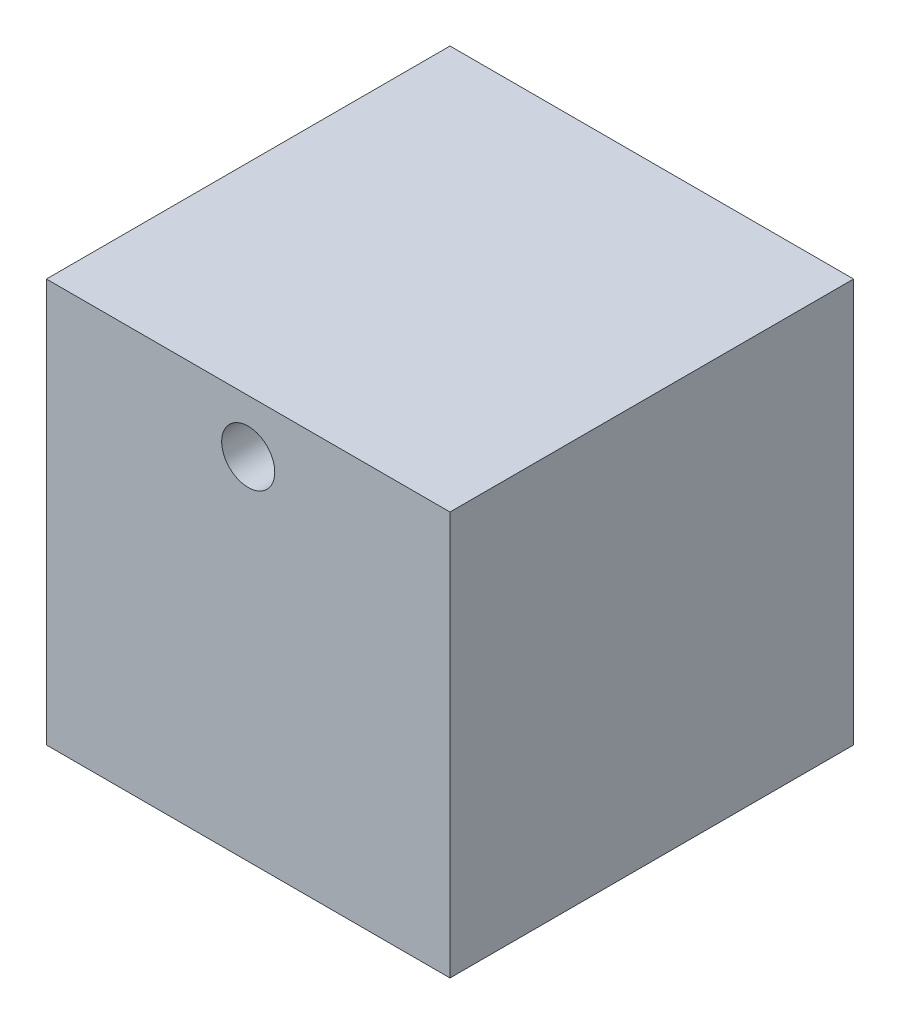
ISO-10303-21;
HEADER;
FILE_DESCRIPTION(('STEP AP214'),'2;1');
FILE_NAME('part.step','',(''),(''),'','','');
FILE_SCHEMA(('AUTOMOTIVE_DESIGN { 1 0 10303 214 1 1 1 1 }'));
ENDSEC;
DATA;
#1=APPLICATION_CONTEXT('core data for automotive mechanical design processes');
#2=APPLICATION_PROTOCOL_DEFINITION('international standard','automotive_design',2000,#1);
#3=PRODUCT_CONTEXT('',#1,'mechanical');
#4=PRODUCT('Part','Part','',(#3));
#5=PRODUCT_RELATED_PRODUCT_CATEGORY('part','',(#4));
#6=PRODUCT_DEFINITION_FORMATION('','',#4);
#7=PRODUCT_DEFINITION_CONTEXT('part definition',#1,'design');
#8=PRODUCT_DEFINITION('design','',#6,#7);
#9=PRODUCT_DEFINITION_SHAPE('','',#8);
#10=(LENGTH_UNIT() NAMED_UNIT(*) SI_UNIT(.MILLI.,.METRE.));
#11=(NAMED_UNIT(*) PLANE_ANGLE_UNIT() SI_UNIT($,.RADIAN.));
#12=(NAMED_UNIT(*) SI_UNIT($,.STERADIAN.) SOLID_ANGLE_UNIT());
#13=UNCERTAINTY_MEASURE_WITH_UNIT(LENGTH_MEASURE(1.E-05),#10,'distance_accuracy_value','');
#14=(GEOMETRIC_REPRESENTATION_CONTEXT(3) GLOBAL_UNCERTAINTY_ASSIGNED_CONTEXT((#13)) GLOBAL_UNIT_ASSIGNED_CONTEXT((#10,
#11,#12)) REPRESENTATION_CONTEXT('',''));
#15=CARTESIAN_POINT('',(0.,0.,0.));
#16=DIRECTION('',(0.,0.,1.));
#17=DIRECTION('',(1.,0.,0.));
#18=AXIS2_PLACEMENT_3D('',#15,#16,#17);
#19=CARTESIAN_POINT('',(0.,0.,38.));
#20=DIRECTION('',(0.,0.,-1.));
#21=DIRECTION('',(-1.,0.,0.));
#22=AXIS2_PLACEMENT_3D('',#19,#20,#21);
#23=PLANE('',#22);
#24=DIRECTION('',(0.,-1.,0.));
#25=VECTOR('',#24,1.);
#26=CARTESIAN_POINT('',(0.,0.,38.));
#27=LINE('',#26,#25);
#28=CARTESIAN_POINT('',(0.,38.,38.));
#29=VERTEX_POINT('',#28);
#30=CARTESIAN_POINT('',(0.,0.,38.));
#31=VERTEX_POINT('',#30);
#32=EDGE_CURVE('E92',#29,#31,#27,.T.);
#33=ORIENTED_EDGE('',*,*,#32,.T.);
#34=DIRECTION('',(1.,0.,0.));
#35=VECTOR('',#34,1.);
#36=CARTESIAN_POINT('',(0.,0.,38.));
#37=LINE('',#36,#35);
#38=CARTESIAN_POINT('',(38.,0.,38.));
#39=VERTEX_POINT('',#38);
#40=EDGE_CURVE('E87',#31,#39,#37,.T.);
#41=ORIENTED_EDGE('',*,*,#40,.T.);
#42=DIRECTION('',(0.,1.,0.));
#43=VECTOR('',#42,1.);
#44=CARTESIAN_POINT('',(38.,0.,38.));
#45=LINE('',#44,#43);
#46=CARTESIAN_POINT('',(38.,38.,38.));
#47=VERTEX_POINT('',#46);
#48=EDGE_CURVE('E90',#39,#47,#45,.T.);
#49=ORIENTED_EDGE('',*,*,#48,.T.);
#50=DIRECTION('',(-1.,0.,0.));
#51=VECTOR('',#50,1.);
#52=CARTESIAN_POINT('',(0.,38.,38.));
#53=LINE('',#52,#51);
#54=EDGE_CURVE('E57',#47,#29,#53,.T.);
#55=ORIENTED_EDGE('',*,*,#54,.T.);
#56=EDGE_LOOP('',(#33,#41,#49,#55));
#57=FACE_BOUND('',#56,.T.);
#58=CARTESIAN_POINT('',(19.,33.,38.));
#59=DIRECTION('',(0.,0.,1.));
#60=DIRECTION('',(1.,0.,0.));
#61=AXIS2_PLACEMENT_3D('',#58,#59,#60);
#62=CIRCLE('',#61,2.5);
#63=CARTESIAN_POINT('',(21.5,33.,38.));
#64=VERTEX_POINT('',#63);
#65=EDGE_CURVE('E112',#64,#64,#62,.T.);
#66=ORIENTED_EDGE('',*,*,#65,.F.);
#67=EDGE_LOOP('',(#66));
#68=FACE_BOUND('',#67,.T.);
#69=ADVANCED_FACE('F39',(#57,#68),#23,.F.);
#70=CARTESIAN_POINT('',(0.,0.,0.));
#71=DIRECTION('',(0.,0.,-1.));
#72=DIRECTION('',(-1.,0.,0.));
#73=AXIS2_PLACEMENT_3D('',#70,#71,#72);
#74=PLANE('',#73);
#75=DIRECTION('',(0.,-1.,0.));
#76=VECTOR('',#75,1.);
#77=CARTESIAN_POINT('',(0.,0.,0.));
#78=LINE('',#77,#76);
#79=CARTESIAN_POINT('',(0.,38.,0.));
#80=VERTEX_POINT('',#79);
#81=CARTESIAN_POINT('',(0.,0.,0.));
#82=VERTEX_POINT('',#81);
#83=EDGE_CURVE('E108',#80,#82,#78,.T.);
#84=ORIENTED_EDGE('',*,*,#83,.F.);
#85=DIRECTION('',(-1.,0.,0.));
#86=VECTOR('',#85,1.);
#87=CARTESIAN_POINT('',(0.,38.,0.));
#88=LINE('',#87,#86);
#89=CARTESIAN_POINT('',(38.,38.,0.));
#90=VERTEX_POINT('',#89);
#91=EDGE_CURVE('E80',#90,#80,#88,.T.);
#92=ORIENTED_EDGE('',*,*,#91,.F.);
#93=DIRECTION('',(0.,1.,0.));
#94=VECTOR('',#93,1.);
#95=CARTESIAN_POINT('',(38.,0.,0.));
#96=LINE('',#95,#94);
#97=CARTESIAN_POINT('',(38.,0.,0.));
#98=VERTEX_POINT('',#97);
#99=EDGE_CURVE('E74',#98,#90,#96,.T.);
#100=ORIENTED_EDGE('',*,*,#99,.F.);
#101=DIRECTION('',(1.,0.,0.));
#102=VECTOR('',#101,1.);
#103=CARTESIAN_POINT('',(0.,0.,0.));
#104=LINE('',#103,#102);
#105=EDGE_CURVE('E97',#82,#98,#104,.T.);
#106=ORIENTED_EDGE('',*,*,#105,.F.);
#107=EDGE_LOOP('',(#84,#92,#100,#106));
#108=FACE_BOUND('',#107,.T.);
#109=CARTESIAN_POINT('',(19.,33.,0.));
#110=DIRECTION('',(0.,0.,1.));
#111=DIRECTION('',(1.,0.,0.));
#112=AXIS2_PLACEMENT_3D('',#109,#110,#111);
#113=CIRCLE('',#112,2.5);
#114=CARTESIAN_POINT('',(21.5,33.,0.));
#115=VERTEX_POINT('',#114);
#116=EDGE_CURVE('E130',#115,#115,#113,.T.);
#117=ORIENTED_EDGE('',*,*,#116,.T.);
#118=EDGE_LOOP('',(#117));
#119=FACE_BOUND('',#118,.T.);
#120=ADVANCED_FACE('F125',(#108,#119),#74,.T.);
#121=CARTESIAN_POINT('',(0.,0.,38.));
#122=DIRECTION('',(1.,0.,0.));
#123=DIRECTION('',(0.,1.,0.));
#124=AXIS2_PLACEMENT_3D('',#121,#122,#123);
#125=PLANE('',#124);
#126=ORIENTED_EDGE('',*,*,#83,.T.);
#127=DIRECTION('',(0.,0.,-1.));
#128=VECTOR('',#127,1.);
#129=CARTESIAN_POINT('',(0.,0.,38.));
#130=LINE('',#129,#128);
#131=EDGE_CURVE('E11',#31,#82,#130,.T.);
#132=ORIENTED_EDGE('',*,*,#131,.F.);
#133=ORIENTED_EDGE('',*,*,#32,.F.);
#134=DIRECTION('',(0.,0.,-1.));
#135=VECTOR('',#134,1.);
#136=CARTESIAN_POINT('',(0.,38.,38.));
#137=LINE('',#136,#135);
#138=EDGE_CURVE('E104',#29,#80,#137,.T.);
#139=ORIENTED_EDGE('',*,*,#138,.T.);
#140=EDGE_LOOP('',(#126,#132,#133,#139));
#141=FACE_BOUND('',#140,.T.);
#142=ADVANCED_FACE('F41',(#141),#125,.F.);
#143=CARTESIAN_POINT('',(0.,0.,38.));
#144=DIRECTION('',(0.,1.,0.));
#145=DIRECTION('',(0.,0.,1.));
#146=AXIS2_PLACEMENT_3D('',#143,#144,#145);
#147=PLANE('',#146);
#148=ORIENTED_EDGE('',*,*,#105,.T.);
#149=DIRECTION('',(0.,0.,-1.));
#150=VECTOR('',#149,1.);
#151=CARTESIAN_POINT('',(38.,0.,38.));
#152=LINE('',#151,#150);
#153=EDGE_CURVE('E49',#39,#98,#152,.T.);
#154=ORIENTED_EDGE('',*,*,#153,.F.);
#155=ORIENTED_EDGE('',*,*,#40,.F.);
#156=ORIENTED_EDGE('',*,*,#131,.T.);
#157=EDGE_LOOP('',(#148,#154,#155,#156));
#158=FACE_BOUND('',#157,.T.);
#159=ADVANCED_FACE('F96',(#158),#147,.F.);
#160=CARTESIAN_POINT('',(38.,0.,38.));
#161=DIRECTION('',(-1.,0.,0.));
#162=DIRECTION('',(0.,-1.,0.));
#163=AXIS2_PLACEMENT_3D('',#160,#161,#162);
#164=PLANE('',#163);
#165=ORIENTED_EDGE('',*,*,#99,.T.);
#166=DIRECTION('',(0.,0.,-1.));
#167=VECTOR('',#166,1.);
#168=CARTESIAN_POINT('',(38.,38.,38.));
#169=LINE('',#168,#167);
#170=EDGE_CURVE('E99',#47,#90,#169,.T.);
#171=ORIENTED_EDGE('',*,*,#170,.F.);
#172=ORIENTED_EDGE('',*,*,#48,.F.);
#173=ORIENTED_EDGE('',*,*,#153,.T.);
#174=EDGE_LOOP('',(#165,#171,#172,#173));
#175=FACE_BOUND('',#174,.T.);
#176=ADVANCED_FACE('F100',(#175),#164,.F.);
#177=CARTESIAN_POINT('',(0.,38.,38.));
#178=DIRECTION('',(0.,-1.,0.));
#179=DIRECTION('',(0.,0.,-1.));
#180=AXIS2_PLACEMENT_3D('',#177,#178,#179);
#181=PLANE('',#180);
#182=ORIENTED_EDGE('',*,*,#91,.T.);
#183=ORIENTED_EDGE('',*,*,#138,.F.);
#184=ORIENTED_EDGE('',*,*,#54,.F.);
#185=ORIENTED_EDGE('',*,*,#170,.T.);
#186=EDGE_LOOP('',(#182,#183,#184,#185));
#187=FACE_BOUND('',#186,.T.);
#188=ADVANCED_FACE('F122',(#187),#181,.F.);
#189=CARTESIAN_POINT('',(19.,33.,38.));
#190=DIRECTION('',(0.,0.,-1.));
#191=DIRECTION('',(-1.,0.,0.));
#192=AXIS2_PLACEMENT_3D('',#189,#190,#191);
#193=CYLINDRICAL_SURFACE('',#192,2.5);
#194=ORIENTED_EDGE('',*,*,#65,.T.);
#195=EDGE_LOOP('',(#194));
#196=FACE_BOUND('',#195,.T.);
#197=ORIENTED_EDGE('',*,*,#116,.F.);
#198=EDGE_LOOP('',(#197));
#199=FACE_BOUND('',#198,.T.);
#200=ADVANCED_FACE('F138',(#196,#199),#193,.F.);
#201=CLOSED_SHELL('',(#69,#120,#142,#159,#176,#188,#200));
#202=MANIFOLD_SOLID_BREP('B2',#201);
#203=ADVANCED_BREP_SHAPE_REPRESENTATION('',(#18,#202),#14);
#204=SHAPE_DEFINITION_REPRESENTATION(#9,#203);
ENDSEC;
END-ISO-10303-21;
